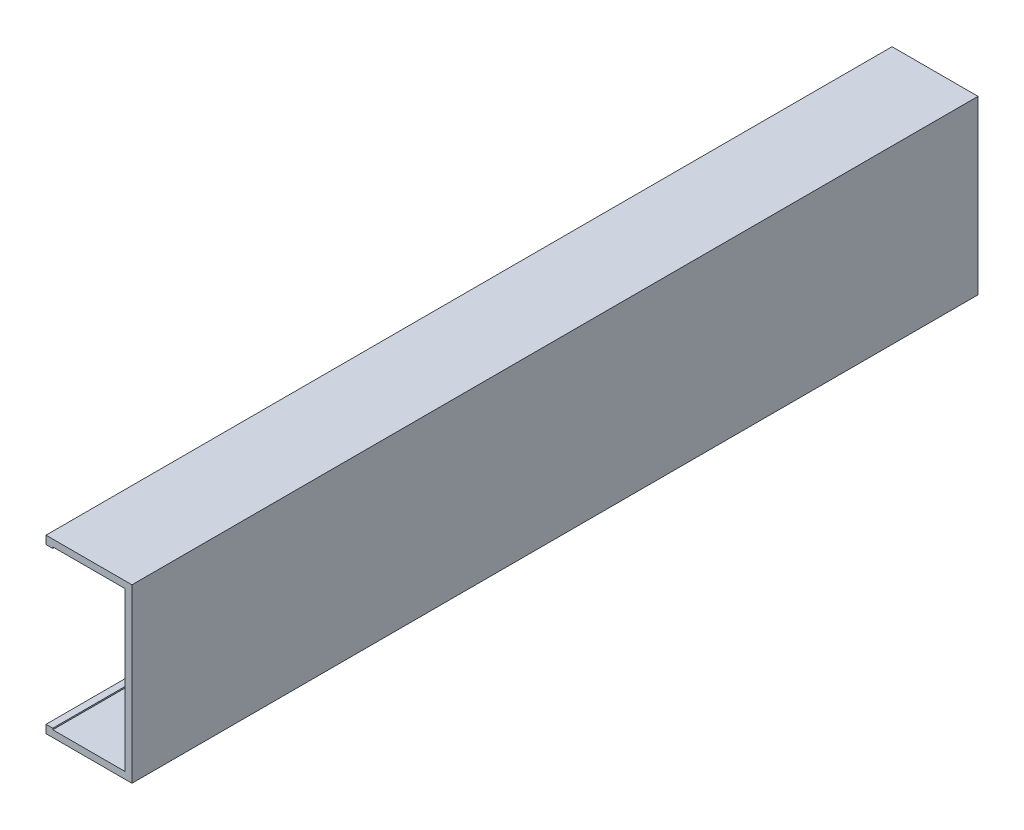
ISO-10303-21;
HEADER;
FILE_DESCRIPTION(('STEP AP214'),'2;1');
FILE_NAME('part.step','',(''),(''),'','','');
FILE_SCHEMA(('AUTOMOTIVE_DESIGN { 1 0 10303 214 1 1 1 1 }'));
ENDSEC;
DATA;
#1=APPLICATION_CONTEXT('core data for automotive mechanical design processes');
#2=APPLICATION_PROTOCOL_DEFINITION('international standard','automotive_design',2000,#1);
#3=PRODUCT_CONTEXT('',#1,'mechanical');
#4=PRODUCT('Part','Part','',(#3));
#5=PRODUCT_RELATED_PRODUCT_CATEGORY('part','',(#4));
#6=PRODUCT_DEFINITION_FORMATION('','',#4);
#7=PRODUCT_DEFINITION_CONTEXT('part definition',#1,'design');
#8=PRODUCT_DEFINITION('design','',#6,#7);
#9=PRODUCT_DEFINITION_SHAPE('','',#8);
#10=(LENGTH_UNIT() NAMED_UNIT(*) SI_UNIT(.MILLI.,.METRE.));
#11=(NAMED_UNIT(*) PLANE_ANGLE_UNIT() SI_UNIT($,.RADIAN.));
#12=(NAMED_UNIT(*) SI_UNIT($,.STERADIAN.) SOLID_ANGLE_UNIT());
#13=UNCERTAINTY_MEASURE_WITH_UNIT(LENGTH_MEASURE(1.E-05),#10,'distance_accuracy_value','');
#14=(GEOMETRIC_REPRESENTATION_CONTEXT(3) GLOBAL_UNCERTAINTY_ASSIGNED_CONTEXT((#13)) GLOBAL_UNIT_ASSIGNED_CONTEXT((#10,
#11,#12)) REPRESENTATION_CONTEXT('',''));
#15=CARTESIAN_POINT('',(0.,0.,0.));
#16=DIRECTION('',(0.,0.,1.));
#17=DIRECTION('',(1.,0.,0.));
#18=AXIS2_PLACEMENT_3D('',#15,#16,#17);
#19=CARTESIAN_POINT('',(0.,0.,250.));
#20=DIRECTION('',(0.,0.,-1.));
#21=DIRECTION('',(-1.,0.,0.));
#22=AXIS2_PLACEMENT_3D('',#19,#20,#21);
#23=PLANE('',#22);
#24=DIRECTION('',(0.,-1.,0.));
#25=VECTOR('',#24,1.);
#26=CARTESIAN_POINT('',(-10.7,-23.4,250.));
#27=LINE('',#26,#25);
#28=CARTESIAN_POINT('',(-10.7,-23.,250.));
#29=VERTEX_POINT('',#28);
#30=CARTESIAN_POINT('',(-10.7,-23.4,250.));
#31=VERTEX_POINT('',#30);
#32=EDGE_CURVE('E215',#29,#31,#27,.T.);
#33=ORIENTED_EDGE('',*,*,#32,.F.);
#34=DIRECTION('',(-1.,0.,0.));
#35=VECTOR('',#34,1.);
#36=CARTESIAN_POINT('',(7.29999999999999,-23.,250.));
#37=LINE('',#36,#35);
#38=CARTESIAN_POINT('',(-12.7,-23.,250.));
#39=VERTEX_POINT('',#38);
#40=EDGE_CURVE('E169',#29,#39,#37,.T.);
#41=ORIENTED_EDGE('',*,*,#40,.T.);
#42=DIRECTION('',(0.,-1.,0.));
#43=VECTOR('',#42,1.);
#44=CARTESIAN_POINT('',(-12.7,-25.4,250.));
#45=LINE('',#44,#43);
#46=CARTESIAN_POINT('',(-12.7,-25.4,250.));
#47=VERTEX_POINT('',#46);
#48=EDGE_CURVE('E264',#39,#47,#45,.T.);
#49=ORIENTED_EDGE('',*,*,#48,.T.);
#50=DIRECTION('',(1.,0.,0.));
#51=VECTOR('',#50,1.);
#52=CARTESIAN_POINT('',(-12.7,-25.4,250.));
#53=LINE('',#52,#51);
#54=CARTESIAN_POINT('',(12.7,-25.4,250.));
#55=VERTEX_POINT('',#54);
#56=EDGE_CURVE('E269',#47,#55,#53,.T.);
#57=ORIENTED_EDGE('',*,*,#56,.T.);
#58=DIRECTION('',(0.,1.,0.));
#59=VECTOR('',#58,1.);
#60=CARTESIAN_POINT('',(12.7,-25.4,250.));
#61=LINE('',#60,#59);
#62=CARTESIAN_POINT('',(12.7,25.4,250.));
#63=VERTEX_POINT('',#62);
#64=EDGE_CURVE('E256',#55,#63,#61,.T.);
#65=ORIENTED_EDGE('',*,*,#64,.T.);
#66=DIRECTION('',(-1.,0.,0.));
#67=VECTOR('',#66,1.);
#68=CARTESIAN_POINT('',(-12.7,25.4,250.));
#69=LINE('',#68,#67);
#70=CARTESIAN_POINT('',(-12.7,25.4,250.));
#71=VERTEX_POINT('',#70);
#72=EDGE_CURVE('E260',#63,#71,#69,.T.);
#73=ORIENTED_EDGE('',*,*,#72,.T.);
#74=CARTESIAN_POINT('',(-12.7,23.,250.));
#75=VERTEX_POINT('',#74);
#76=EDGE_CURVE('E265',#71,#75,#45,.T.);
#77=ORIENTED_EDGE('',*,*,#76,.T.);
#78=DIRECTION('',(-1.,0.,0.));
#79=VECTOR('',#78,1.);
#80=CARTESIAN_POINT('',(7.29999999999999,23.,250.));
#81=LINE('',#80,#79);
#82=CARTESIAN_POINT('',(-10.7,23.,250.));
#83=VERTEX_POINT('',#82);
#84=EDGE_CURVE('E199',#83,#75,#81,.T.);
#85=ORIENTED_EDGE('',*,*,#84,.F.);
#86=CARTESIAN_POINT('',(-10.7,23.4,250.));
#87=VERTEX_POINT('',#86);
#88=EDGE_CURVE('E210',#87,#83,#27,.T.);
#89=ORIENTED_EDGE('',*,*,#88,.F.);
#90=DIRECTION('',(-1.,0.,0.));
#91=VECTOR('',#90,1.);
#92=CARTESIAN_POINT('',(-10.7,23.4,250.));
#93=LINE('',#92,#91);
#94=CARTESIAN_POINT('',(10.7,23.4,250.));
#95=VERTEX_POINT('',#94);
#96=EDGE_CURVE('E222',#95,#87,#93,.T.);
#97=ORIENTED_EDGE('',*,*,#96,.F.);
#98=DIRECTION('',(0.,1.,0.));
#99=VECTOR('',#98,1.);
#100=CARTESIAN_POINT('',(10.7,-23.4,250.));
#101=LINE('',#100,#99);
#102=CARTESIAN_POINT('',(10.7,-23.4,250.));
#103=VERTEX_POINT('',#102);
#104=EDGE_CURVE('E218',#103,#95,#101,.T.);
#105=ORIENTED_EDGE('',*,*,#104,.F.);
#106=DIRECTION('',(1.,0.,0.));
#107=VECTOR('',#106,1.);
#108=CARTESIAN_POINT('',(-10.7,-23.4,250.));
#109=LINE('',#108,#107);
#110=EDGE_CURVE('E214',#31,#103,#109,.T.);
#111=ORIENTED_EDGE('',*,*,#110,.F.);
#112=EDGE_LOOP('',(#33,#41,#49,#57,#65,#73,#77,#85,#89,#97,#105,#111));
#113=FACE_BOUND('',#112,.T.);
#114=ADVANCED_FACE('F38',(#113),#23,.F.);
#115=CARTESIAN_POINT('',(0.,0.,0.));
#116=DIRECTION('',(0.,0.,-1.));
#117=DIRECTION('',(-1.,0.,0.));
#118=AXIS2_PLACEMENT_3D('',#115,#116,#117);
#119=PLANE('',#118);
#120=DIRECTION('',(-1.,0.,0.));
#121=VECTOR('',#120,1.);
#122=CARTESIAN_POINT('',(7.29999999999999,-23.,0.));
#123=LINE('',#122,#121);
#124=CARTESIAN_POINT('',(-10.7,-23.,0.));
#125=VERTEX_POINT('',#124);
#126=CARTESIAN_POINT('',(-12.7,-23.,0.));
#127=VERTEX_POINT('',#126);
#128=EDGE_CURVE('E184',#125,#127,#123,.T.);
#129=ORIENTED_EDGE('',*,*,#128,.F.);
#130=DIRECTION('',(0.,-1.,0.));
#131=VECTOR('',#130,1.);
#132=CARTESIAN_POINT('',(-10.7,-23.4,0.));
#133=LINE('',#132,#131);
#134=CARTESIAN_POINT('',(-10.7,-23.4,0.));
#135=VERTEX_POINT('',#134);
#136=EDGE_CURVE('E183',#125,#135,#133,.T.);
#137=ORIENTED_EDGE('',*,*,#136,.T.);
#138=DIRECTION('',(1.,0.,0.));
#139=VECTOR('',#138,1.);
#140=CARTESIAN_POINT('',(-10.7,-23.4,0.));
#141=LINE('',#140,#139);
#142=CARTESIAN_POINT('',(10.7,-23.4,0.));
#143=VERTEX_POINT('',#142);
#144=EDGE_CURVE('E230',#135,#143,#141,.T.);
#145=ORIENTED_EDGE('',*,*,#144,.T.);
#146=DIRECTION('',(0.,1.,0.));
#147=VECTOR('',#146,1.);
#148=CARTESIAN_POINT('',(10.7,-23.4,0.));
#149=LINE('',#148,#147);
#150=CARTESIAN_POINT('',(10.7,23.4,0.));
#151=VERTEX_POINT('',#150);
#152=EDGE_CURVE('E234',#143,#151,#149,.T.);
#153=ORIENTED_EDGE('',*,*,#152,.T.);
#154=DIRECTION('',(-1.,0.,0.));
#155=VECTOR('',#154,1.);
#156=CARTESIAN_POINT('',(-10.7,23.4,0.));
#157=LINE('',#156,#155);
#158=CARTESIAN_POINT('',(-10.7,23.4,0.));
#159=VERTEX_POINT('',#158);
#160=EDGE_CURVE('E238',#151,#159,#157,.T.);
#161=ORIENTED_EDGE('',*,*,#160,.T.);
#162=CARTESIAN_POINT('',(-10.7,23.,0.));
#163=VERTEX_POINT('',#162);
#164=EDGE_CURVE('E226',#159,#163,#133,.T.);
#165=ORIENTED_EDGE('',*,*,#164,.T.);
#166=DIRECTION('',(-1.,0.,0.));
#167=VECTOR('',#166,1.);
#168=CARTESIAN_POINT('',(7.29999999999999,23.,0.));
#169=LINE('',#168,#167);
#170=CARTESIAN_POINT('',(-12.7,23.,0.));
#171=VERTEX_POINT('',#170);
#172=EDGE_CURVE('E62',#163,#171,#169,.T.);
#173=ORIENTED_EDGE('',*,*,#172,.T.);
#174=DIRECTION('',(0.,-1.,0.));
#175=VECTOR('',#174,1.);
#176=CARTESIAN_POINT('',(-12.7,-25.4,0.));
#177=LINE('',#176,#175);
#178=CARTESIAN_POINT('',(-12.7,25.4,0.));
#179=VERTEX_POINT('',#178);
#180=EDGE_CURVE('E175',#179,#171,#177,.T.);
#181=ORIENTED_EDGE('',*,*,#180,.F.);
#182=DIRECTION('',(-1.,0.,0.));
#183=VECTOR('',#182,1.);
#184=CARTESIAN_POINT('',(-12.7,25.4,0.));
#185=LINE('',#184,#183);
#186=CARTESIAN_POINT('',(12.7,25.4,0.));
#187=VERTEX_POINT('',#186);
#188=EDGE_CURVE('E276',#187,#179,#185,.T.);
#189=ORIENTED_EDGE('',*,*,#188,.F.);
#190=DIRECTION('',(0.,1.,0.));
#191=VECTOR('',#190,1.);
#192=CARTESIAN_POINT('',(12.7,-25.4,0.));
#193=LINE('',#192,#191);
#194=CARTESIAN_POINT('',(12.7,-25.4,0.));
#195=VERTEX_POINT('',#194);
#196=EDGE_CURVE('E255',#195,#187,#193,.T.);
#197=ORIENTED_EDGE('',*,*,#196,.F.);
#198=DIRECTION('',(1.,0.,0.));
#199=VECTOR('',#198,1.);
#200=CARTESIAN_POINT('',(-12.7,-25.4,0.));
#201=LINE('',#200,#199);
#202=CARTESIAN_POINT('',(-12.7,-25.4,0.));
#203=VERTEX_POINT('',#202);
#204=EDGE_CURVE('E261',#203,#195,#201,.T.);
#205=ORIENTED_EDGE('',*,*,#204,.F.);
#206=EDGE_CURVE('E279',#127,#203,#177,.T.);
#207=ORIENTED_EDGE('',*,*,#206,.F.);
#208=EDGE_LOOP('',(#129,#137,#145,#153,#161,#165,#173,#181,#189,#197,#205,#207));
#209=FACE_BOUND('',#208,.T.);
#210=ADVANCED_FACE('F354',(#209),#119,.T.);
#211=CARTESIAN_POINT('',(12.7,-25.4,250.));
#212=DIRECTION('',(-1.,0.,0.));
#213=DIRECTION('',(0.,0.,1.));
#214=AXIS2_PLACEMENT_3D('',#211,#212,#213);
#215=PLANE('',#214);
#216=ORIENTED_EDGE('',*,*,#196,.T.);
#217=DIRECTION('',(0.,0.,-1.));
#218=VECTOR('',#217,1.);
#219=CARTESIAN_POINT('',(12.7,25.4,250.));
#220=LINE('',#219,#218);
#221=EDGE_CURVE('E294',#63,#187,#220,.T.);
#222=ORIENTED_EDGE('',*,*,#221,.F.);
#223=ORIENTED_EDGE('',*,*,#64,.F.);
#224=DIRECTION('',(0.,0.,-1.));
#225=VECTOR('',#224,1.);
#226=CARTESIAN_POINT('',(12.7,-25.4,250.));
#227=LINE('',#226,#225);
#228=EDGE_CURVE('E272',#55,#195,#227,.T.);
#229=ORIENTED_EDGE('',*,*,#228,.T.);
#230=EDGE_LOOP('',(#216,#222,#223,#229));
#231=FACE_BOUND('',#230,.T.);
#232=ADVANCED_FACE('F40',(#231),#215,.F.);
#233=CARTESIAN_POINT('',(-12.7,25.4,250.));
#234=DIRECTION('',(0.,-1.,0.));
#235=DIRECTION('',(0.,0.,-1.));
#236=AXIS2_PLACEMENT_3D('',#233,#234,#235);
#237=PLANE('',#236);
#238=ORIENTED_EDGE('',*,*,#188,.T.);
#239=DIRECTION('',(0.,0.,-1.));
#240=VECTOR('',#239,1.);
#241=CARTESIAN_POINT('',(-12.7,25.4,250.));
#242=LINE('',#241,#240);
#243=EDGE_CURVE('E291',#71,#179,#242,.T.);
#244=ORIENTED_EDGE('',*,*,#243,.F.);
#245=ORIENTED_EDGE('',*,*,#72,.F.);
#246=ORIENTED_EDGE('',*,*,#221,.T.);
#247=EDGE_LOOP('',(#238,#244,#245,#246));
#248=FACE_BOUND('',#247,.T.);
#249=ADVANCED_FACE('F342',(#248),#237,.F.);
#250=CARTESIAN_POINT('',(-12.7,-25.4,250.));
#251=DIRECTION('',(1.,0.,0.));
#252=DIRECTION('',(0.,0.,-1.));
#253=AXIS2_PLACEMENT_3D('',#250,#251,#252);
#254=PLANE('',#253);
#255=DIRECTION('',(0.,1.,0.));
#256=VECTOR('',#255,1.);
#257=CARTESIAN_POINT('',(-12.7,-23.,80.));
#258=LINE('',#257,#256);
#259=CARTESIAN_POINT('',(-12.7,-23.,80.));
#260=VERTEX_POINT('',#259);
#261=CARTESIAN_POINT('',(-12.7,23.,80.));
#262=VERTEX_POINT('',#261);
#263=EDGE_CURVE('E161',#260,#262,#258,.T.);
#264=ORIENTED_EDGE('',*,*,#263,.F.);
#265=DIRECTION('',(0.,0.,1.));
#266=VECTOR('',#265,1.);
#267=CARTESIAN_POINT('',(-12.7,-23.,0.));
#268=LINE('',#267,#266);
#269=EDGE_CURVE('E158',#127,#260,#268,.T.);
#270=ORIENTED_EDGE('',*,*,#269,.F.);
#271=ORIENTED_EDGE('',*,*,#206,.T.);
#272=DIRECTION('',(0.,0.,-1.));
#273=VECTOR('',#272,1.);
#274=CARTESIAN_POINT('',(-12.7,-25.4,250.));
#275=LINE('',#274,#273);
#276=EDGE_CURVE('E287',#47,#203,#275,.T.);
#277=ORIENTED_EDGE('',*,*,#276,.F.);
#278=ORIENTED_EDGE('',*,*,#48,.F.);
#279=DIRECTION('',(0.,0.,1.));
#280=VECTOR('',#279,1.);
#281=CARTESIAN_POINT('',(-12.7,-23.,250.));
#282=LINE('',#281,#280);
#283=CARTESIAN_POINT('',(-12.7,-23.,170.));
#284=VERTEX_POINT('',#283);
#285=EDGE_CURVE('E196',#284,#39,#282,.T.);
#286=ORIENTED_EDGE('',*,*,#285,.F.);
#287=DIRECTION('',(0.,-1.,0.));
#288=VECTOR('',#287,1.);
#289=CARTESIAN_POINT('',(-12.7,-23.,170.));
#290=LINE('',#289,#288);
#291=CARTESIAN_POINT('',(-12.7,23.,170.));
#292=VERTEX_POINT('',#291);
#293=EDGE_CURVE('E192',#292,#284,#290,.T.);
#294=ORIENTED_EDGE('',*,*,#293,.F.);
#295=DIRECTION('',(0.,0.,-1.));
#296=VECTOR('',#295,1.);
#297=CARTESIAN_POINT('',(-12.7,23.,250.));
#298=LINE('',#297,#296);
#299=EDGE_CURVE('E189',#75,#292,#298,.T.);
#300=ORIENTED_EDGE('',*,*,#299,.F.);
#301=ORIENTED_EDGE('',*,*,#76,.F.);
#302=ORIENTED_EDGE('',*,*,#243,.T.);
#303=ORIENTED_EDGE('',*,*,#180,.T.);
#304=DIRECTION('',(0.,0.,-1.));
#305=VECTOR('',#304,1.);
#306=CARTESIAN_POINT('',(-12.7,23.,0.));
#307=LINE('',#306,#305);
#308=EDGE_CURVE('E153',#262,#171,#307,.T.);
#309=ORIENTED_EDGE('',*,*,#308,.F.);
#310=EDGE_LOOP('',(#264,#270,#271,#277,#278,#286,#294,#300,#301,#302,#303,#309));
#311=FACE_BOUND('',#310,.T.);
#312=ADVANCED_FACE('F172',(#311),#254,.F.);
#313=CARTESIAN_POINT('',(-12.7,-25.4,250.));
#314=DIRECTION('',(0.,1.,0.));
#315=DIRECTION('',(0.,0.,1.));
#316=AXIS2_PLACEMENT_3D('',#313,#314,#315);
#317=PLANE('',#316);
#318=ORIENTED_EDGE('',*,*,#204,.T.);
#319=ORIENTED_EDGE('',*,*,#228,.F.);
#320=ORIENTED_EDGE('',*,*,#56,.F.);
#321=ORIENTED_EDGE('',*,*,#276,.T.);
#322=EDGE_LOOP('',(#318,#319,#320,#321));
#323=FACE_BOUND('',#322,.T.);
#324=ADVANCED_FACE('F333',(#323),#317,.F.);
#325=CARTESIAN_POINT('',(-10.7,-23.4,250.));
#326=DIRECTION('',(1.,0.,0.));
#327=DIRECTION('',(0.,0.,-1.));
#328=AXIS2_PLACEMENT_3D('',#325,#326,#327);
#329=PLANE('',#328);
#330=DIRECTION('',(0.,0.,-1.));
#331=VECTOR('',#330,1.);
#332=CARTESIAN_POINT('',(-10.7,-23.,250.));
#333=LINE('',#332,#331);
#334=CARTESIAN_POINT('',(-10.7,-23.,80.));
#335=VERTEX_POINT('',#334);
#336=EDGE_CURVE('E11',#335,#125,#333,.T.);
#337=ORIENTED_EDGE('',*,*,#336,.F.);
#338=DIRECTION('',(0.,-1.,0.));
#339=VECTOR('',#338,1.);
#340=CARTESIAN_POINT('',(-10.7,-23.4,80.));
#341=LINE('',#340,#339);
#342=CARTESIAN_POINT('',(-10.7,23.,80.));
#343=VERTEX_POINT('',#342);
#344=EDGE_CURVE('E47',#343,#335,#341,.T.);
#345=ORIENTED_EDGE('',*,*,#344,.F.);
#346=DIRECTION('',(0.,0.,1.));
#347=VECTOR('',#346,1.);
#348=CARTESIAN_POINT('',(-10.7,23.,250.));
#349=LINE('',#348,#347);
#350=EDGE_CURVE('E154',#163,#343,#349,.T.);
#351=ORIENTED_EDGE('',*,*,#350,.F.);
#352=ORIENTED_EDGE('',*,*,#164,.F.);
#353=DIRECTION('',(0.,0.,-1.));
#354=VECTOR('',#353,1.);
#355=CARTESIAN_POINT('',(-10.7,23.4,250.));
#356=LINE('',#355,#354);
#357=EDGE_CURVE('E225',#87,#159,#356,.T.);
#358=ORIENTED_EDGE('',*,*,#357,.F.);
#359=ORIENTED_EDGE('',*,*,#88,.T.);
#360=DIRECTION('',(0.,0.,1.));
#361=VECTOR('',#360,1.);
#362=CARTESIAN_POINT('',(-10.7,23.,250.));
#363=LINE('',#362,#361);
#364=CARTESIAN_POINT('',(-10.7,23.,170.));
#365=VERTEX_POINT('',#364);
#366=EDGE_CURVE('E298',#365,#83,#363,.T.);
#367=ORIENTED_EDGE('',*,*,#366,.F.);
#368=DIRECTION('',(0.,1.,0.));
#369=VECTOR('',#368,1.);
#370=CARTESIAN_POINT('',(-10.7,-23.4,170.));
#371=LINE('',#370,#369);
#372=CARTESIAN_POINT('',(-10.7,-23.,170.));
#373=VERTEX_POINT('',#372);
#374=EDGE_CURVE('E301',#373,#365,#371,.T.);
#375=ORIENTED_EDGE('',*,*,#374,.F.);
#376=DIRECTION('',(0.,0.,-1.));
#377=VECTOR('',#376,1.);
#378=CARTESIAN_POINT('',(-10.7,-23.,250.));
#379=LINE('',#378,#377);
#380=EDGE_CURVE('E304',#29,#373,#379,.T.);
#381=ORIENTED_EDGE('',*,*,#380,.F.);
#382=ORIENTED_EDGE('',*,*,#32,.T.);
#383=DIRECTION('',(0.,0.,-1.));
#384=VECTOR('',#383,1.);
#385=CARTESIAN_POINT('',(-10.7,-23.4,250.));
#386=LINE('',#385,#384);
#387=EDGE_CURVE('E251',#31,#135,#386,.T.);
#388=ORIENTED_EDGE('',*,*,#387,.T.);
#389=ORIENTED_EDGE('',*,*,#136,.F.);
#390=EDGE_LOOP('',(#337,#345,#351,#352,#358,#359,#367,#375,#381,#382,#388,#389));
#391=FACE_BOUND('',#390,.T.);
#392=ADVANCED_FACE('F315',(#391),#329,.T.);
#393=CARTESIAN_POINT('',(-10.7,-23.4,250.));
#394=DIRECTION('',(0.,1.,0.));
#395=DIRECTION('',(-1.,0.,0.));
#396=AXIS2_PLACEMENT_3D('',#393,#394,#395);
#397=PLANE('',#396);
#398=ORIENTED_EDGE('',*,*,#144,.F.);
#399=ORIENTED_EDGE('',*,*,#387,.F.);
#400=ORIENTED_EDGE('',*,*,#110,.T.);
#401=DIRECTION('',(0.,0.,-1.));
#402=VECTOR('',#401,1.);
#403=CARTESIAN_POINT('',(10.7,-23.4,250.));
#404=LINE('',#403,#402);
#405=EDGE_CURVE('E248',#103,#143,#404,.T.);
#406=ORIENTED_EDGE('',*,*,#405,.T.);
#407=EDGE_LOOP('',(#398,#399,#400,#406));
#408=FACE_BOUND('',#407,.T.);
#409=ADVANCED_FACE('F362',(#408),#397,.T.);
#410=CARTESIAN_POINT('',(10.7,-23.4,250.));
#411=DIRECTION('',(-1.,0.,0.));
#412=DIRECTION('',(0.,0.,1.));
#413=AXIS2_PLACEMENT_3D('',#410,#411,#412);
#414=PLANE('',#413);
#415=ORIENTED_EDGE('',*,*,#152,.F.);
#416=ORIENTED_EDGE('',*,*,#405,.F.);
#417=ORIENTED_EDGE('',*,*,#104,.T.);
#418=DIRECTION('',(0.,0.,-1.));
#419=VECTOR('',#418,1.);
#420=CARTESIAN_POINT('',(10.7,23.4,250.));
#421=LINE('',#420,#419);
#422=EDGE_CURVE('E245',#95,#151,#421,.T.);
#423=ORIENTED_EDGE('',*,*,#422,.T.);
#424=EDGE_LOOP('',(#415,#416,#417,#423));
#425=FACE_BOUND('',#424,.T.);
#426=ADVANCED_FACE('F358',(#425),#414,.T.);
#427=CARTESIAN_POINT('',(-10.7,23.4,250.));
#428=DIRECTION('',(0.,-1.,0.));
#429=DIRECTION('',(0.,0.,-1.));
#430=AXIS2_PLACEMENT_3D('',#427,#428,#429);
#431=PLANE('',#430);
#432=ORIENTED_EDGE('',*,*,#160,.F.);
#433=ORIENTED_EDGE('',*,*,#422,.F.);
#434=ORIENTED_EDGE('',*,*,#96,.T.);
#435=ORIENTED_EDGE('',*,*,#357,.T.);
#436=EDGE_LOOP('',(#432,#433,#434,#435));
#437=FACE_BOUND('',#436,.T.);
#438=ADVANCED_FACE('F353',(#437),#431,.T.);
#439=CARTESIAN_POINT('',(7.29999999999999,-23.,250.));
#440=DIRECTION('',(0.,-1.,0.));
#441=DIRECTION('',(0.,0.,-1.));
#442=AXIS2_PLACEMENT_3D('',#439,#440,#441);
#443=PLANE('',#442);
#444=ORIENTED_EDGE('',*,*,#380,.T.);
#445=DIRECTION('',(-1.,0.,0.));
#446=VECTOR('',#445,1.);
#447=CARTESIAN_POINT('',(7.29999999999999,-23.,170.));
#448=LINE('',#447,#446);
#449=EDGE_CURVE('E203',#373,#284,#448,.T.);
#450=ORIENTED_EDGE('',*,*,#449,.T.);
#451=ORIENTED_EDGE('',*,*,#285,.T.);
#452=ORIENTED_EDGE('',*,*,#40,.F.);
#453=EDGE_LOOP('',(#444,#450,#451,#452));
#454=FACE_BOUND('',#453,.T.);
#455=ADVANCED_FACE('F409',(#454),#443,.F.);
#456=CARTESIAN_POINT('',(7.29999999999999,-23.,170.));
#457=DIRECTION('',(0.,0.,-1.));
#458=DIRECTION('',(-1.,0.,0.));
#459=AXIS2_PLACEMENT_3D('',#456,#457,#458);
#460=PLANE('',#459);
#461=ORIENTED_EDGE('',*,*,#374,.T.);
#462=DIRECTION('',(-1.,0.,0.));
#463=VECTOR('',#462,1.);
#464=CARTESIAN_POINT('',(7.29999999999999,23.,170.));
#465=LINE('',#464,#463);
#466=EDGE_CURVE('E54',#365,#292,#465,.T.);
#467=ORIENTED_EDGE('',*,*,#466,.T.);
#468=ORIENTED_EDGE('',*,*,#293,.T.);
#469=ORIENTED_EDGE('',*,*,#449,.F.);
#470=EDGE_LOOP('',(#461,#467,#468,#469));
#471=FACE_BOUND('',#470,.T.);
#472=ADVANCED_FACE('F414',(#471),#460,.F.);
#473=CARTESIAN_POINT('',(7.29999999999999,23.,250.));
#474=DIRECTION('',(0.,1.,0.));
#475=DIRECTION('',(0.,0.,1.));
#476=AXIS2_PLACEMENT_3D('',#473,#474,#475);
#477=PLANE('',#476);
#478=ORIENTED_EDGE('',*,*,#366,.T.);
#479=ORIENTED_EDGE('',*,*,#84,.T.);
#480=ORIENTED_EDGE('',*,*,#299,.T.);
#481=ORIENTED_EDGE('',*,*,#466,.F.);
#482=EDGE_LOOP('',(#478,#479,#480,#481));
#483=FACE_BOUND('',#482,.T.);
#484=ADVANCED_FACE('F345',(#483),#477,.F.);
#485=CARTESIAN_POINT('',(7.29999999999999,-23.,80.));
#486=DIRECTION('',(0.,0.,1.));
#487=DIRECTION('',(1.,0.,0.));
#488=AXIS2_PLACEMENT_3D('',#485,#486,#487);
#489=PLANE('',#488);
#490=ORIENTED_EDGE('',*,*,#344,.T.);
#491=DIRECTION('',(-1.,0.,0.));
#492=VECTOR('',#491,1.);
#493=CARTESIAN_POINT('',(7.29999999999999,-23.,80.));
#494=LINE('',#493,#492);
#495=EDGE_CURVE('E164',#335,#260,#494,.T.);
#496=ORIENTED_EDGE('',*,*,#495,.T.);
#497=ORIENTED_EDGE('',*,*,#263,.T.);
#498=DIRECTION('',(-1.,0.,0.));
#499=VECTOR('',#498,1.);
#500=CARTESIAN_POINT('',(7.29999999999999,23.,80.));
#501=LINE('',#500,#499);
#502=EDGE_CURVE('E149',#343,#262,#501,.T.);
#503=ORIENTED_EDGE('',*,*,#502,.F.);
#504=EDGE_LOOP('',(#490,#496,#497,#503));
#505=FACE_BOUND('',#504,.T.);
#506=ADVANCED_FACE('F162',(#505),#489,.F.);
#507=CARTESIAN_POINT('',(7.29999999999999,-23.,0.));
#508=DIRECTION('',(0.,-1.,0.));
#509=DIRECTION('',(0.,0.,-1.));
#510=AXIS2_PLACEMENT_3D('',#507,#508,#509);
#511=PLANE('',#510);
#512=ORIENTED_EDGE('',*,*,#336,.T.);
#513=ORIENTED_EDGE('',*,*,#128,.T.);
#514=ORIENTED_EDGE('',*,*,#269,.T.);
#515=ORIENTED_EDGE('',*,*,#495,.F.);
#516=EDGE_LOOP('',(#512,#513,#514,#515));
#517=FACE_BOUND('',#516,.T.);
#518=ADVANCED_FACE('F312',(#517),#511,.F.);
#519=CARTESIAN_POINT('',(7.29999999999999,23.,0.));
#520=DIRECTION('',(0.,1.,0.));
#521=DIRECTION('',(0.,0.,1.));
#522=AXIS2_PLACEMENT_3D('',#519,#520,#521);
#523=PLANE('',#522);
#524=ORIENTED_EDGE('',*,*,#350,.T.);
#525=ORIENTED_EDGE('',*,*,#502,.T.);
#526=ORIENTED_EDGE('',*,*,#308,.T.);
#527=ORIENTED_EDGE('',*,*,#172,.F.);
#528=EDGE_LOOP('',(#524,#525,#526,#527));
#529=FACE_BOUND('',#528,.T.);
#530=ADVANCED_FACE('F151',(#529),#523,.F.);
#531=CLOSED_SHELL('',(#114,#210,#232,#249,#312,#324,#392,#409,#426,#438,#455,#472,#484,#506,
#518,#530));
#532=MANIFOLD_SOLID_BREP('B2',#531);
#533=ADVANCED_BREP_SHAPE_REPRESENTATION('',(#18,#532),#14);
#534=SHAPE_DEFINITION_REPRESENTATION(#9,#533);
ENDSEC;
END-ISO-10303-21;
